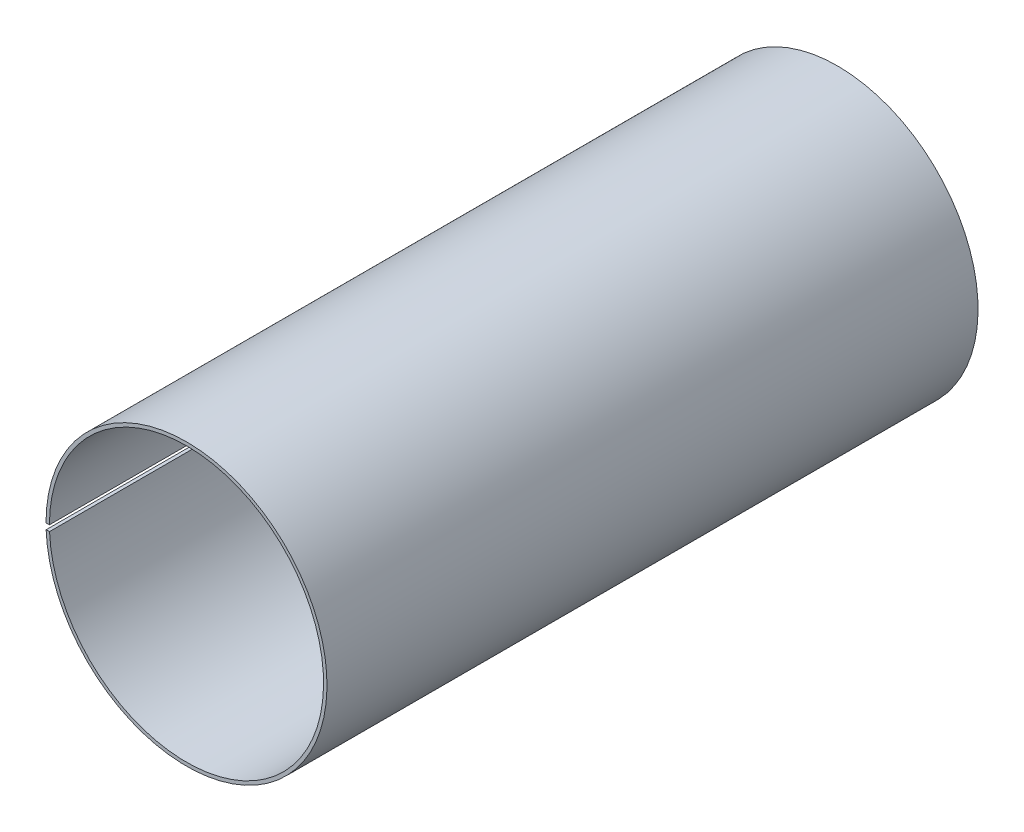
ISO-10303-21;
HEADER;
FILE_DESCRIPTION(('STEP AP214'),'2;1');
FILE_NAME('part.step','',(''),(''),'','','');
FILE_SCHEMA(('AUTOMOTIVE_DESIGN { 1 0 10303 214 1 1 1 1 }'));
ENDSEC;
DATA;
#1=APPLICATION_CONTEXT('core data for automotive mechanical design processes');
#2=APPLICATION_PROTOCOL_DEFINITION('international standard','automotive_design',2000,#1);
#3=PRODUCT_CONTEXT('',#1,'mechanical');
#4=PRODUCT('Part','Part','',(#3));
#5=PRODUCT_RELATED_PRODUCT_CATEGORY('part','',(#4));
#6=PRODUCT_DEFINITION_FORMATION('','',#4);
#7=PRODUCT_DEFINITION_CONTEXT('part definition',#1,'design');
#8=PRODUCT_DEFINITION('design','',#6,#7);
#9=PRODUCT_DEFINITION_SHAPE('','',#8);
#10=(LENGTH_UNIT() NAMED_UNIT(*) SI_UNIT(.MILLI.,.METRE.));
#11=(NAMED_UNIT(*) PLANE_ANGLE_UNIT() SI_UNIT($,.RADIAN.));
#12=(NAMED_UNIT(*) SI_UNIT($,.STERADIAN.) SOLID_ANGLE_UNIT());
#13=UNCERTAINTY_MEASURE_WITH_UNIT(LENGTH_MEASURE(1.E-05),#10,'distance_accuracy_value','');
#14=(GEOMETRIC_REPRESENTATION_CONTEXT(3) GLOBAL_UNCERTAINTY_ASSIGNED_CONTEXT((#13)) GLOBAL_UNIT_ASSIGNED_CONTEXT((#10,
#11,#12)) REPRESENTATION_CONTEXT('',''));
#15=CARTESIAN_POINT('',(0.,0.,0.));
#16=DIRECTION('',(0.,0.,1.));
#17=DIRECTION('',(1.,0.,0.));
#18=AXIS2_PLACEMENT_3D('',#15,#16,#17);
#19=CARTESIAN_POINT('',(0.,0.,1900.));
#20=DIRECTION('',(0.,0.,-1.));
#21=DIRECTION('',(-1.,0.,0.));
#22=AXIS2_PLACEMENT_3D('',#19,#20,#21);
#23=CYLINDRICAL_SURFACE('',#22,410.);
#24=CARTESIAN_POINT('',(0.,0.,0.));
#25=DIRECTION('',(0.,0.,1.));
#26=DIRECTION('',(1.,0.,0.));
#27=AXIS2_PLACEMENT_3D('',#24,#25,#26);
#28=CIRCLE('',#27,410.);
#29=CARTESIAN_POINT('',(-409.64051124258,-17.1654172369146,0.));
#30=VERTEX_POINT('',#29);
#31=CARTESIAN_POINT('',(-410.,0.,0.));
#32=VERTEX_POINT('',#31);
#33=EDGE_CURVE('E96',#30,#32,#28,.T.);
#34=ORIENTED_EDGE('',*,*,#33,.T.);
#35=DIRECTION('',(0.,0.,-1.));
#36=VECTOR('',#35,1.);
#37=CARTESIAN_POINT('',(-410.,0.,1900.));
#38=LINE('',#37,#36);
#39=CARTESIAN_POINT('',(-410.,0.,1900.));
#40=VERTEX_POINT('',#39);
#41=EDGE_CURVE('E11',#40,#32,#38,.T.);
#42=ORIENTED_EDGE('',*,*,#41,.F.);
#43=CARTESIAN_POINT('',(0.,0.,1900.));
#44=DIRECTION('',(0.,0.,1.));
#45=DIRECTION('',(1.,0.,0.));
#46=AXIS2_PLACEMENT_3D('',#43,#44,#45);
#47=CIRCLE('',#46,410.);
#48=CARTESIAN_POINT('',(-409.64051124258,-17.1654172369146,1900.));
#49=VERTEX_POINT('',#48);
#50=EDGE_CURVE('E84',#49,#40,#47,.T.);
#51=ORIENTED_EDGE('',*,*,#50,.F.);
#52=DIRECTION('',(0.,0.,-1.));
#53=VECTOR('',#52,1.);
#54=CARTESIAN_POINT('',(-409.64051124258,-17.1654172369146,1900.));
#55=LINE('',#54,#53);
#56=EDGE_CURVE('E92',#49,#30,#55,.T.);
#57=ORIENTED_EDGE('',*,*,#56,.T.);
#58=EDGE_LOOP('',(#34,#42,#51,#57));
#59=FACE_BOUND('',#58,.T.);
#60=ADVANCED_FACE('F33',(#59),#23,.T.);
#61=CARTESIAN_POINT('',(-410.,0.,1900.));
#62=DIRECTION('',(0.,1.,0.));
#63=DIRECTION('',(0.,0.,1.));
#64=AXIS2_PLACEMENT_3D('',#61,#62,#63);
#65=PLANE('',#64);
#66=DIRECTION('',(1.,0.,0.));
#67=VECTOR('',#66,1.);
#68=CARTESIAN_POINT('',(-410.,0.,0.));
#69=LINE('',#68,#67);
#70=CARTESIAN_POINT('',(-400.,0.,0.));
#71=VERTEX_POINT('',#70);
#72=EDGE_CURVE('E88',#32,#71,#69,.T.);
#73=ORIENTED_EDGE('',*,*,#72,.T.);
#74=DIRECTION('',(0.,0.,-1.));
#75=VECTOR('',#74,1.);
#76=CARTESIAN_POINT('',(-400.,0.,1900.));
#77=LINE('',#76,#75);
#78=CARTESIAN_POINT('',(-400.,0.,1900.));
#79=VERTEX_POINT('',#78);
#80=EDGE_CURVE('E41',#79,#71,#77,.T.);
#81=ORIENTED_EDGE('',*,*,#80,.F.);
#82=DIRECTION('',(1.,0.,0.));
#83=VECTOR('',#82,1.);
#84=CARTESIAN_POINT('',(-410.,0.,1900.));
#85=LINE('',#84,#83);
#86=EDGE_CURVE('E79',#40,#79,#85,.T.);
#87=ORIENTED_EDGE('',*,*,#86,.F.);
#88=ORIENTED_EDGE('',*,*,#41,.T.);
#89=EDGE_LOOP('',(#73,#81,#87,#88));
#90=FACE_BOUND('',#89,.T.);
#91=ADVANCED_FACE('F87',(#90),#65,.F.);
#92=CARTESIAN_POINT('',(0.,0.,1900.));
#93=DIRECTION('',(0.,0.,-1.));
#94=DIRECTION('',(-1.,0.,0.));
#95=AXIS2_PLACEMENT_3D('',#92,#93,#94);
#96=CYLINDRICAL_SURFACE('',#95,400.);
#97=CARTESIAN_POINT('',(0.,0.,0.));
#98=DIRECTION('',(0.,0.,-1.));
#99=DIRECTION('',(1.,0.,0.));
#100=AXIS2_PLACEMENT_3D('',#97,#98,#99);
#101=CIRCLE('',#100,400.);
#102=CARTESIAN_POINT('',(-399.649279261054,-16.7467485238191,0.));
#103=VERTEX_POINT('',#102);
#104=EDGE_CURVE('E66',#71,#103,#101,.T.);
#105=ORIENTED_EDGE('',*,*,#104,.T.);
#106=DIRECTION('',(0.,0.,-1.));
#107=VECTOR('',#106,1.);
#108=CARTESIAN_POINT('',(-399.649279261054,-16.7467485238191,1900.));
#109=LINE('',#108,#107);
#110=CARTESIAN_POINT('',(-399.649279261054,-16.7467485238191,1900.));
#111=VERTEX_POINT('',#110);
#112=EDGE_CURVE('E89',#111,#103,#109,.T.);
#113=ORIENTED_EDGE('',*,*,#112,.F.);
#114=CARTESIAN_POINT('',(0.,0.,1900.));
#115=DIRECTION('',(0.,0.,-1.));
#116=DIRECTION('',(1.,0.,0.));
#117=AXIS2_PLACEMENT_3D('',#114,#115,#116);
#118=CIRCLE('',#117,400.);
#119=EDGE_CURVE('E82',#79,#111,#118,.T.);
#120=ORIENTED_EDGE('',*,*,#119,.F.);
#121=ORIENTED_EDGE('',*,*,#80,.T.);
#122=EDGE_LOOP('',(#105,#113,#120,#121));
#123=FACE_BOUND('',#122,.T.);
#124=ADVANCED_FACE('F90',(#123),#96,.F.);
#125=CARTESIAN_POINT('',(-409.64051124258,-17.1654172369146,1900.));
#126=DIRECTION('',(0.0418668713095477,-0.999123198152635,0.));
#127=DIRECTION('',(0.999123198152635,0.0418668713095477,0.));
#128=AXIS2_PLACEMENT_3D('',#125,#126,#127);
#129=PLANE('',#128);
#130=DIRECTION('',(-0.999123198152635,-0.0418668713095477,0.));
#131=VECTOR('',#130,1.);
#132=CARTESIAN_POINT('',(-409.64051124258,-17.1654172369146,0.));
#133=LINE('',#132,#131);
#134=EDGE_CURVE('E72',#103,#30,#133,.T.);
#135=ORIENTED_EDGE('',*,*,#134,.T.);
#136=ORIENTED_EDGE('',*,*,#56,.F.);
#137=DIRECTION('',(-0.999123198152635,-0.0418668713095477,0.));
#138=VECTOR('',#137,1.);
#139=CARTESIAN_POINT('',(-409.64051124258,-17.1654172369146,1900.));
#140=LINE('',#139,#138);
#141=EDGE_CURVE('E49',#111,#49,#140,.T.);
#142=ORIENTED_EDGE('',*,*,#141,.F.);
#143=ORIENTED_EDGE('',*,*,#112,.T.);
#144=EDGE_LOOP('',(#135,#136,#142,#143));
#145=FACE_BOUND('',#144,.T.);
#146=ADVANCED_FACE('F103',(#145),#129,.F.);
#147=CARTESIAN_POINT('',(0.,0.,1900.));
#148=DIRECTION('',(0.,0.,1.));
#149=DIRECTION('',(1.,0.,0.));
#150=AXIS2_PLACEMENT_3D('',#147,#148,#149);
#151=PLANE('',#150);
#152=ORIENTED_EDGE('',*,*,#50,.T.);
#153=ORIENTED_EDGE('',*,*,#86,.T.);
#154=ORIENTED_EDGE('',*,*,#119,.T.);
#155=ORIENTED_EDGE('',*,*,#141,.T.);
#156=EDGE_LOOP('',(#152,#153,#154,#155));
#157=FACE_BOUND('',#156,.T.);
#158=ADVANCED_FACE('F80',(#157),#151,.T.);
#159=CARTESIAN_POINT('',(0.,0.,0.));
#160=DIRECTION('',(0.,0.,1.));
#161=DIRECTION('',(1.,0.,0.));
#162=AXIS2_PLACEMENT_3D('',#159,#160,#161);
#163=PLANE('',#162);
#164=ORIENTED_EDGE('',*,*,#33,.F.);
#165=ORIENTED_EDGE('',*,*,#134,.F.);
#166=ORIENTED_EDGE('',*,*,#104,.F.);
#167=ORIENTED_EDGE('',*,*,#72,.F.);
#168=EDGE_LOOP('',(#164,#165,#166,#167));
#169=FACE_BOUND('',#168,.T.);
#170=ADVANCED_FACE('F106',(#169),#163,.F.);
#171=CLOSED_SHELL('',(#60,#91,#124,#146,#158,#170));
#172=MANIFOLD_SOLID_BREP('B2',#171);
#173=ADVANCED_BREP_SHAPE_REPRESENTATION('',(#18,#172),#14);
#174=SHAPE_DEFINITION_REPRESENTATION(#9,#173);
ENDSEC;
END-ISO-10303-21;
